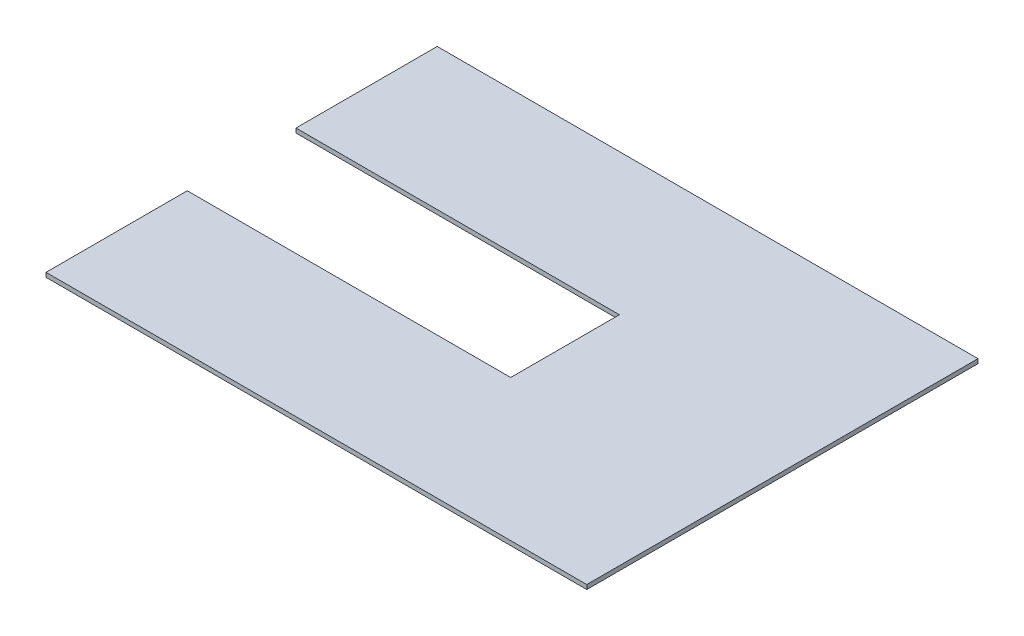
ISO-10303-21;
HEADER;
FILE_DESCRIPTION(('STEP AP214'),'2;1');
FILE_NAME('part.step','',(''),(''),'','','');
FILE_SCHEMA(('AUTOMOTIVE_DESIGN { 1 0 10303 214 1 1 1 1 }'));
ENDSEC;
DATA;
#1=APPLICATION_CONTEXT('core data for automotive mechanical design processes');
#2=APPLICATION_PROTOCOL_DEFINITION('international standard','automotive_design',2000,#1);
#3=PRODUCT_CONTEXT('',#1,'mechanical');
#4=PRODUCT('Part','Part','',(#3));
#5=PRODUCT_RELATED_PRODUCT_CATEGORY('part','',(#4));
#6=PRODUCT_DEFINITION_FORMATION('','',#4);
#7=PRODUCT_DEFINITION_CONTEXT('part definition',#1,'design');
#8=PRODUCT_DEFINITION('design','',#6,#7);
#9=PRODUCT_DEFINITION_SHAPE('','',#8);
#10=(LENGTH_UNIT() NAMED_UNIT(*) SI_UNIT(.MILLI.,.METRE.));
#11=(NAMED_UNIT(*) PLANE_ANGLE_UNIT() SI_UNIT($,.RADIAN.));
#12=(NAMED_UNIT(*) SI_UNIT($,.STERADIAN.) SOLID_ANGLE_UNIT());
#13=UNCERTAINTY_MEASURE_WITH_UNIT(LENGTH_MEASURE(1.E-05),#10,'distance_accuracy_value','');
#14=(GEOMETRIC_REPRESENTATION_CONTEXT(3) GLOBAL_UNCERTAINTY_ASSIGNED_CONTEXT((#13)) GLOBAL_UNIT_ASSIGNED_CONTEXT((#10,
#11,#12)) REPRESENTATION_CONTEXT('',''));
#15=CARTESIAN_POINT('',(0.,0.,0.));
#16=DIRECTION('',(0.,0.,1.));
#17=DIRECTION('',(1.,0.,0.));
#18=AXIS2_PLACEMENT_3D('',#15,#16,#17);
#19=CARTESIAN_POINT('',(24.4,2.,0.));
#20=DIRECTION('',(1.,0.,0.));
#21=DIRECTION('',(0.,0.,-1.));
#22=AXIS2_PLACEMENT_3D('',#19,#20,#21);
#23=PLANE('',#22);
#24=DIRECTION('',(0.,0.,1.));
#25=VECTOR('',#24,1.);
#26=CARTESIAN_POINT('',(24.4,0.,0.));
#27=LINE('',#26,#25);
#28=CARTESIAN_POINT('',(24.4,0.,-25.));
#29=VERTEX_POINT('',#28);
#30=CARTESIAN_POINT('',(24.4,0.,25.));
#31=VERTEX_POINT('',#30);
#32=EDGE_CURVE('E150',#29,#31,#27,.T.);
#33=ORIENTED_EDGE('',*,*,#32,.T.);
#34=DIRECTION('',(0.,-1.,0.));
#35=VECTOR('',#34,1.);
#36=CARTESIAN_POINT('',(24.4,2.,25.));
#37=LINE('',#36,#35);
#38=CARTESIAN_POINT('',(24.4,2.,25.));
#39=VERTEX_POINT('',#38);
#40=EDGE_CURVE('E11',#39,#31,#37,.T.);
#41=ORIENTED_EDGE('',*,*,#40,.F.);
#42=DIRECTION('',(0.,0.,1.));
#43=VECTOR('',#42,1.);
#44=CARTESIAN_POINT('',(24.4,2.,0.));
#45=LINE('',#44,#43);
#46=CARTESIAN_POINT('',(24.4,2.,-25.));
#47=VERTEX_POINT('',#46);
#48=EDGE_CURVE('E174',#47,#39,#45,.T.);
#49=ORIENTED_EDGE('',*,*,#48,.F.);
#50=DIRECTION('',(0.,-1.,0.));
#51=VECTOR('',#50,1.);
#52=CARTESIAN_POINT('',(24.4,2.,-25.));
#53=LINE('',#52,#51);
#54=EDGE_CURVE('E62',#47,#29,#53,.T.);
#55=ORIENTED_EDGE('',*,*,#54,.T.);
#56=EDGE_LOOP('',(#33,#41,#49,#55));
#57=FACE_BOUND('',#56,.T.);
#58=ADVANCED_FACE('F45',(#57),#23,.F.);
#59=CARTESIAN_POINT('',(0.,2.,25.));
#60=DIRECTION('',(0.,0.,1.));
#61=DIRECTION('',(1.,0.,0.));
#62=AXIS2_PLACEMENT_3D('',#59,#60,#61);
#63=PLANE('',#62);
#64=DIRECTION('',(-1.,0.,0.));
#65=VECTOR('',#64,1.);
#66=CARTESIAN_POINT('',(0.,0.,25.));
#67=LINE('',#66,#65);
#68=CARTESIAN_POINT('',(-124.4,0.,25.));
#69=VERTEX_POINT('',#68);
#70=EDGE_CURVE('E153',#31,#69,#67,.T.);
#71=ORIENTED_EDGE('',*,*,#70,.T.);
#72=DIRECTION('',(0.,-1.,0.));
#73=VECTOR('',#72,1.);
#74=CARTESIAN_POINT('',(-124.4,2.,25.));
#75=LINE('',#74,#73);
#76=CARTESIAN_POINT('',(-124.4,2.,25.));
#77=VERTEX_POINT('',#76);
#78=EDGE_CURVE('E54',#77,#69,#75,.T.);
#79=ORIENTED_EDGE('',*,*,#78,.F.);
#80=DIRECTION('',(-1.,0.,0.));
#81=VECTOR('',#80,1.);
#82=CARTESIAN_POINT('',(0.,2.,25.));
#83=LINE('',#82,#81);
#84=EDGE_CURVE('E101',#39,#77,#83,.T.);
#85=ORIENTED_EDGE('',*,*,#84,.F.);
#86=ORIENTED_EDGE('',*,*,#40,.T.);
#87=EDGE_LOOP('',(#71,#79,#85,#86));
#88=FACE_BOUND('',#87,.T.);
#89=ADVANCED_FACE('F209',(#88),#63,.F.);
#90=CARTESIAN_POINT('',(-124.4,2.,0.));
#91=DIRECTION('',(1.,0.,0.));
#92=DIRECTION('',(0.,0.,-1.));
#93=AXIS2_PLACEMENT_3D('',#90,#91,#92);
#94=PLANE('',#93);
#95=DIRECTION('',(0.,0.,1.));
#96=VECTOR('',#95,1.);
#97=CARTESIAN_POINT('',(-124.4,0.,0.));
#98=LINE('',#97,#96);
#99=CARTESIAN_POINT('',(-124.4,0.,90.));
#100=VERTEX_POINT('',#99);
#101=EDGE_CURVE('E156',#69,#100,#98,.T.);
#102=ORIENTED_EDGE('',*,*,#101,.T.);
#103=DIRECTION('',(0.,-1.,0.));
#104=VECTOR('',#103,1.);
#105=CARTESIAN_POINT('',(-124.4,2.,90.));
#106=LINE('',#105,#104);
#107=CARTESIAN_POINT('',(-124.4,2.,90.));
#108=VERTEX_POINT('',#107);
#109=EDGE_CURVE('E184',#108,#100,#106,.T.);
#110=ORIENTED_EDGE('',*,*,#109,.F.);
#111=DIRECTION('',(0.,0.,1.));
#112=VECTOR('',#111,1.);
#113=CARTESIAN_POINT('',(-124.4,2.,0.));
#114=LINE('',#113,#112);
#115=EDGE_CURVE('E136',#77,#108,#114,.T.);
#116=ORIENTED_EDGE('',*,*,#115,.F.);
#117=ORIENTED_EDGE('',*,*,#78,.T.);
#118=EDGE_LOOP('',(#102,#110,#116,#117));
#119=FACE_BOUND('',#118,.T.);
#120=ADVANCED_FACE('F192',(#119),#94,.F.);
#121=CARTESIAN_POINT('',(0.,2.,90.));
#122=DIRECTION('',(0.,0.,-1.));
#123=DIRECTION('',(-1.,0.,0.));
#124=AXIS2_PLACEMENT_3D('',#121,#122,#123);
#125=PLANE('',#124);
#126=DIRECTION('',(1.,0.,0.));
#127=VECTOR('',#126,1.);
#128=CARTESIAN_POINT('',(0.,0.,90.));
#129=LINE('',#128,#127);
#130=CARTESIAN_POINT('',(124.4,0.,90.));
#131=VERTEX_POINT('',#130);
#132=EDGE_CURVE('E159',#100,#131,#129,.T.);
#133=ORIENTED_EDGE('',*,*,#132,.T.);
#134=DIRECTION('',(0.,-1.,0.));
#135=VECTOR('',#134,1.);
#136=CARTESIAN_POINT('',(124.4,2.,90.));
#137=LINE('',#136,#135);
#138=CARTESIAN_POINT('',(124.4,2.,90.));
#139=VERTEX_POINT('',#138);
#140=EDGE_CURVE('E181',#139,#131,#137,.T.);
#141=ORIENTED_EDGE('',*,*,#140,.F.);
#142=DIRECTION('',(1.,0.,0.));
#143=VECTOR('',#142,1.);
#144=CARTESIAN_POINT('',(0.,2.,90.));
#145=LINE('',#144,#143);
#146=EDGE_CURVE('E144',#108,#139,#145,.T.);
#147=ORIENTED_EDGE('',*,*,#146,.F.);
#148=ORIENTED_EDGE('',*,*,#109,.T.);
#149=EDGE_LOOP('',(#133,#141,#147,#148));
#150=FACE_BOUND('',#149,.T.);
#151=ADVANCED_FACE('F200',(#150),#125,.F.);
#152=CARTESIAN_POINT('',(124.4,2.,0.));
#153=DIRECTION('',(1.,0.,0.));
#154=DIRECTION('',(0.,0.,-1.));
#155=AXIS2_PLACEMENT_3D('',#152,#153,#154);
#156=PLANE('',#155);
#157=DIRECTION('',(0.,0.,1.));
#158=VECTOR('',#157,1.);
#159=CARTESIAN_POINT('',(124.4,0.,0.));
#160=LINE('',#159,#158);
#161=CARTESIAN_POINT('',(124.4,0.,-90.));
#162=VERTEX_POINT('',#161);
#163=EDGE_CURVE('E164',#162,#131,#160,.T.);
#164=ORIENTED_EDGE('',*,*,#163,.F.);
#165=DIRECTION('',(0.,-1.,0.));
#166=VECTOR('',#165,1.);
#167=CARTESIAN_POINT('',(124.4,2.,-90.));
#168=LINE('',#167,#166);
#169=CARTESIAN_POINT('',(124.4,2.,-90.));
#170=VERTEX_POINT('',#169);
#171=EDGE_CURVE('E127',#170,#162,#168,.T.);
#172=ORIENTED_EDGE('',*,*,#171,.F.);
#173=DIRECTION('',(0.,0.,1.));
#174=VECTOR('',#173,1.);
#175=CARTESIAN_POINT('',(124.4,2.,0.));
#176=LINE('',#175,#174);
#177=EDGE_CURVE('E140',#170,#139,#176,.T.);
#178=ORIENTED_EDGE('',*,*,#177,.T.);
#179=ORIENTED_EDGE('',*,*,#140,.T.);
#180=EDGE_LOOP('',(#164,#172,#178,#179));
#181=FACE_BOUND('',#180,.T.);
#182=ADVANCED_FACE('F219',(#181),#156,.T.);
#183=CARTESIAN_POINT('',(0.,2.,-90.));
#184=DIRECTION('',(0.,0.,-1.));
#185=DIRECTION('',(-1.,0.,0.));
#186=AXIS2_PLACEMENT_3D('',#183,#184,#185);
#187=PLANE('',#186);
#188=DIRECTION('',(1.,0.,0.));
#189=VECTOR('',#188,1.);
#190=CARTESIAN_POINT('',(0.,0.,-90.));
#191=LINE('',#190,#189);
#192=CARTESIAN_POINT('',(-124.4,0.,-90.));
#193=VERTEX_POINT('',#192);
#194=EDGE_CURVE('E123',#193,#162,#191,.T.);
#195=ORIENTED_EDGE('',*,*,#194,.F.);
#196=DIRECTION('',(0.,-1.,0.));
#197=VECTOR('',#196,1.);
#198=CARTESIAN_POINT('',(-124.4,2.,-90.));
#199=LINE('',#198,#197);
#200=CARTESIAN_POINT('',(-124.4,2.,-90.));
#201=VERTEX_POINT('',#200);
#202=EDGE_CURVE('E117',#201,#193,#199,.T.);
#203=ORIENTED_EDGE('',*,*,#202,.F.);
#204=DIRECTION('',(1.,0.,0.));
#205=VECTOR('',#204,1.);
#206=CARTESIAN_POINT('',(0.,2.,-90.));
#207=LINE('',#206,#205);
#208=EDGE_CURVE('E121',#201,#170,#207,.T.);
#209=ORIENTED_EDGE('',*,*,#208,.T.);
#210=ORIENTED_EDGE('',*,*,#171,.T.);
#211=EDGE_LOOP('',(#195,#203,#209,#210));
#212=FACE_BOUND('',#211,.T.);
#213=ADVANCED_FACE('F119',(#212),#187,.T.);
#214=CARTESIAN_POINT('',(-124.4,0.,-25.));
#215=VERTEX_POINT('',#214);
#216=EDGE_CURVE('E160',#193,#215,#98,.T.);
#217=ORIENTED_EDGE('',*,*,#216,.T.);
#218=DIRECTION('',(0.,-1.,0.));
#219=VECTOR('',#218,1.);
#220=CARTESIAN_POINT('',(-124.4,2.,-25.));
#221=LINE('',#220,#219);
#222=CARTESIAN_POINT('',(-124.4,2.,-25.));
#223=VERTEX_POINT('',#222);
#224=EDGE_CURVE('E89',#223,#215,#221,.T.);
#225=ORIENTED_EDGE('',*,*,#224,.F.);
#226=EDGE_CURVE('E129',#201,#223,#114,.T.);
#227=ORIENTED_EDGE('',*,*,#226,.F.);
#228=ORIENTED_EDGE('',*,*,#202,.T.);
#229=EDGE_LOOP('',(#217,#225,#227,#228));
#230=FACE_BOUND('',#229,.T.);
#231=ADVANCED_FACE('F130',(#230),#94,.F.);
#232=CARTESIAN_POINT('',(0.,2.,-25.));
#233=DIRECTION('',(0.,0.,1.));
#234=DIRECTION('',(1.,0.,0.));
#235=AXIS2_PLACEMENT_3D('',#232,#233,#234);
#236=PLANE('',#235);
#237=DIRECTION('',(-1.,0.,0.));
#238=VECTOR('',#237,1.);
#239=CARTESIAN_POINT('',(0.,0.,-25.));
#240=LINE('',#239,#238);
#241=EDGE_CURVE('E170',#29,#215,#240,.T.);
#242=ORIENTED_EDGE('',*,*,#241,.F.);
#243=ORIENTED_EDGE('',*,*,#54,.F.);
#244=DIRECTION('',(-1.,0.,0.));
#245=VECTOR('',#244,1.);
#246=CARTESIAN_POINT('',(0.,2.,-25.));
#247=LINE('',#246,#245);
#248=EDGE_CURVE('E134',#47,#223,#247,.T.);
#249=ORIENTED_EDGE('',*,*,#248,.T.);
#250=ORIENTED_EDGE('',*,*,#224,.T.);
#251=EDGE_LOOP('',(#242,#243,#249,#250));
#252=FACE_BOUND('',#251,.T.);
#253=ADVANCED_FACE('F226',(#252),#236,.T.);
#254=CARTESIAN_POINT('',(0.,2.,0.));
#255=DIRECTION('',(0.,1.,0.));
#256=DIRECTION('',(0.,0.,1.));
#257=AXIS2_PLACEMENT_3D('',#254,#255,#256);
#258=PLANE('',#257);
#259=ORIENTED_EDGE('',*,*,#48,.T.);
#260=ORIENTED_EDGE('',*,*,#84,.T.);
#261=ORIENTED_EDGE('',*,*,#115,.T.);
#262=ORIENTED_EDGE('',*,*,#146,.T.);
#263=ORIENTED_EDGE('',*,*,#177,.F.);
#264=ORIENTED_EDGE('',*,*,#208,.F.);
#265=ORIENTED_EDGE('',*,*,#226,.T.);
#266=ORIENTED_EDGE('',*,*,#248,.F.);
#267=EDGE_LOOP('',(#259,#260,#261,#262,#263,#264,#265,#266));
#268=FACE_BOUND('',#267,.T.);
#269=ADVANCED_FACE('F138',(#268),#258,.T.);
#270=CARTESIAN_POINT('',(0.,0.,0.));
#271=DIRECTION('',(0.,1.,0.));
#272=DIRECTION('',(0.,0.,1.));
#273=AXIS2_PLACEMENT_3D('',#270,#271,#272);
#274=PLANE('',#273);
#275=ORIENTED_EDGE('',*,*,#32,.F.);
#276=ORIENTED_EDGE('',*,*,#241,.T.);
#277=ORIENTED_EDGE('',*,*,#216,.F.);
#278=ORIENTED_EDGE('',*,*,#194,.T.);
#279=ORIENTED_EDGE('',*,*,#163,.T.);
#280=ORIENTED_EDGE('',*,*,#132,.F.);
#281=ORIENTED_EDGE('',*,*,#101,.F.);
#282=ORIENTED_EDGE('',*,*,#70,.F.);
#283=EDGE_LOOP('',(#275,#276,#277,#278,#279,#280,#281,#282));
#284=FACE_BOUND('',#283,.T.);
#285=ADVANCED_FACE('F196',(#284),#274,.F.);
#286=CLOSED_SHELL('',(#58,#89,#120,#151,#182,#213,#231,#253,#269,#285));
#287=MANIFOLD_SOLID_BREP('B2',#286);
#288=ADVANCED_BREP_SHAPE_REPRESENTATION('',(#18,#287),#14);
#289=SHAPE_DEFINITION_REPRESENTATION(#9,#288);
ENDSEC;
END-ISO-10303-21;
